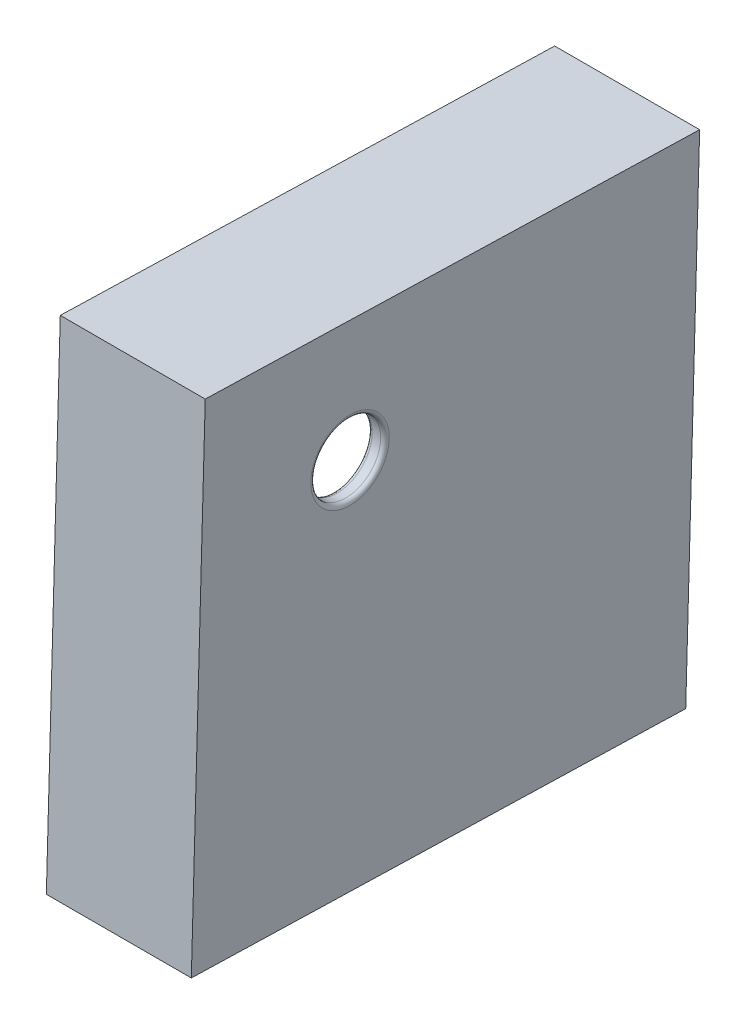
ISO-10303-21;
HEADER;
FILE_DESCRIPTION(('STEP AP214'),'2;1');
FILE_NAME('part.step','',(''),(''),'','','');
FILE_SCHEMA(('AUTOMOTIVE_DESIGN { 1 0 10303 214 1 1 1 1 }'));
ENDSEC;
DATA;
#1=APPLICATION_CONTEXT('core data for automotive mechanical design processes');
#2=APPLICATION_PROTOCOL_DEFINITION('international standard','automotive_design',2000,#1);
#3=PRODUCT_CONTEXT('',#1,'mechanical');
#4=PRODUCT('Part','Part','',(#3));
#5=PRODUCT_RELATED_PRODUCT_CATEGORY('part','',(#4));
#6=PRODUCT_DEFINITION_FORMATION('','',#4);
#7=PRODUCT_DEFINITION_CONTEXT('part definition',#1,'design');
#8=PRODUCT_DEFINITION('design','',#6,#7);
#9=PRODUCT_DEFINITION_SHAPE('','',#8);
#10=(LENGTH_UNIT() NAMED_UNIT(*) SI_UNIT(.MILLI.,.METRE.));
#11=(NAMED_UNIT(*) PLANE_ANGLE_UNIT() SI_UNIT($,.RADIAN.));
#12=(NAMED_UNIT(*) SI_UNIT($,.STERADIAN.) SOLID_ANGLE_UNIT());
#13=UNCERTAINTY_MEASURE_WITH_UNIT(LENGTH_MEASURE(1.E-05),#10,'distance_accuracy_value','');
#14=(GEOMETRIC_REPRESENTATION_CONTEXT(3) GLOBAL_UNCERTAINTY_ASSIGNED_CONTEXT((#13)) GLOBAL_UNIT_ASSIGNED_CONTEXT((#10,
#11,#12)) REPRESENTATION_CONTEXT('',''));
#15=CARTESIAN_POINT('',(0.,0.,0.));
#16=DIRECTION('',(0.,0.,1.));
#17=DIRECTION('',(1.,0.,0.));
#18=AXIS2_PLACEMENT_3D('',#15,#16,#17);
#19=CARTESIAN_POINT('',(-15.,0.,0.));
#20=DIRECTION('',(1.,0.,0.));
#21=DIRECTION('',(0.,0.,-1.));
#22=AXIS2_PLACEMENT_3D('',#19,#20,#21);
#23=PLANE('',#22);
#24=DIRECTION('',(0.,0.0281634546287368,0.999603331238634));
#25=VECTOR('',#24,1.);
#26=CARTESIAN_POINT('',(-15.,5.50132580674706,5.1891220228491));
#27=LINE('',#26,#25);
#28=CARTESIAN_POINT('',(-15.,3.98049925679527,-48.7894578640372));
#29=VERTEX_POINT('',#28);
#30=CARTESIAN_POINT('',(-15.,5.50132580674706,5.1891220228491));
#31=VERTEX_POINT('',#30);
#32=EDGE_CURVE('E175',#29,#31,#27,.T.);
#33=ORIENTED_EDGE('',*,*,#32,.T.);
#34=DIRECTION('',(0.,-0.999603331238634,0.0281634546287368));
#35=VECTOR('',#34,1.);
#36=CARTESIAN_POINT('',(-15.,-48.4772540801392,6.70994857280088));
#37=LINE('',#36,#35);
#38=CARTESIAN_POINT('',(-15.,-48.4772540801392,6.70994857280088));
#39=VERTEX_POINT('',#38);
#40=EDGE_CURVE('E11',#31,#39,#37,.T.);
#41=ORIENTED_EDGE('',*,*,#40,.T.);
#42=DIRECTION('',(0.,-0.028163454628737,-0.999603331238634));
#43=VECTOR('',#42,1.);
#44=CARTESIAN_POINT('',(-15.,-49.998080630091,-47.2686313140854));
#45=LINE('',#44,#43);
#46=CARTESIAN_POINT('',(-15.,-49.998080630091,-47.2686313140854));
#47=VERTEX_POINT('',#46);
#48=EDGE_CURVE('E51',#39,#47,#45,.T.);
#49=ORIENTED_EDGE('',*,*,#48,.T.);
#50=DIRECTION('',(0.,0.999603331238634,-0.0281634546287368));
#51=VECTOR('',#50,1.);
#52=CARTESIAN_POINT('',(-15.,3.98049925679527,-48.7894578640372));
#53=LINE('',#52,#51);
#54=EDGE_CURVE('E173',#47,#29,#53,.T.);
#55=ORIENTED_EDGE('',*,*,#54,.T.);
#56=EDGE_LOOP('',(#33,#41,#49,#55));
#57=FACE_BOUND('',#56,.T.);
#58=DIRECTION('',(0.,-0.999603331238634,0.0281634546287368));
#59=VECTOR('',#58,1.);
#60=CARTESIAN_POINT('',(-15.,-50.420133833359,8.76548214453563));
#61=LINE('',#60,#59);
#62=CARTESIAN_POINT('',(-15.,7.5568593784818,7.13200177606889));
#63=VERTEX_POINT('',#62);
#64=CARTESIAN_POINT('',(-15.,-50.420133833359,8.76548214453563));
#65=VERTEX_POINT('',#64);
#66=EDGE_CURVE('E179',#63,#65,#61,.T.);
#67=ORIENTED_EDGE('',*,*,#66,.F.);
#68=DIRECTION('',(0.,0.0281634546287368,0.999603331238634));
#69=VECTOR('',#68,1.);
#70=CARTESIAN_POINT('',(-15.,7.5568593784818,7.13200177606889));
#71=LINE('',#70,#69);
#72=CARTESIAN_POINT('',(-15.,5.92337901001507,-50.8449914357719));
#73=VERTEX_POINT('',#72);
#74=EDGE_CURVE('E178',#73,#63,#71,.T.);
#75=ORIENTED_EDGE('',*,*,#74,.F.);
#76=DIRECTION('',(0.,0.999603331238634,-0.0281634546287367));
#77=VECTOR('',#76,1.);
#78=CARTESIAN_POINT('',(-15.,5.92337901001507,-50.8449914357719));
#79=LINE('',#78,#77);
#80=CARTESIAN_POINT('',(-15.,-52.0536142018258,-49.2115110673052));
#81=VERTEX_POINT('',#80);
#82=EDGE_CURVE('E170',#81,#73,#79,.T.);
#83=ORIENTED_EDGE('',*,*,#82,.F.);
#84=DIRECTION('',(0.,-0.0281634546287368,-0.999603331238634));
#85=VECTOR('',#84,1.);
#86=CARTESIAN_POINT('',(-15.,-52.0536142018258,-49.2115110673052));
#87=LINE('',#86,#85);
#88=EDGE_CURVE('E46',#65,#81,#87,.T.);
#89=ORIENTED_EDGE('',*,*,#88,.F.);
#90=EDGE_LOOP('',(#67,#75,#83,#89));
#91=FACE_BOUND('',#90,.T.);
#92=ADVANCED_FACE('F43',(#57,#91),#23,.F.);
#93=CARTESIAN_POINT('',(-18.61,-52.0536142018258,-49.2115110673052));
#94=DIRECTION('',(0.,0.999603331238634,-0.0281634546287368));
#95=DIRECTION('',(0.,0.0281634546287368,0.999603331238634));
#96=AXIS2_PLACEMENT_3D('',#93,#94,#95);
#97=PLANE('',#96);
#98=DIRECTION('',(1.,0.,0.));
#99=VECTOR('',#98,1.);
#100=CARTESIAN_POINT('',(-18.61,-50.420133833359,8.76548214453563));
#101=LINE('',#100,#99);
#102=CARTESIAN_POINT('',(2.,-50.420133833359,8.76548214453563));
#103=VERTEX_POINT('',#102);
#104=EDGE_CURVE('E157',#65,#103,#101,.T.);
#105=ORIENTED_EDGE('',*,*,#104,.F.);
#106=ORIENTED_EDGE('',*,*,#88,.T.);
#107=DIRECTION('',(1.,0.,0.));
#108=VECTOR('',#107,1.);
#109=CARTESIAN_POINT('',(-18.61,-52.0536142018258,-49.2115110673052));
#110=LINE('',#109,#108);
#111=CARTESIAN_POINT('',(2.,-52.0536142018258,-49.2115110673052));
#112=VERTEX_POINT('',#111);
#113=EDGE_CURVE('E107',#81,#112,#110,.T.);
#114=ORIENTED_EDGE('',*,*,#113,.T.);
#115=DIRECTION('',(0.,-0.0281634546287368,-0.999603331238634));
#116=VECTOR('',#115,1.);
#117=CARTESIAN_POINT('',(2.,-52.0536142018258,-49.2115110673052));
#118=LINE('',#117,#116);
#119=EDGE_CURVE('E112',#103,#112,#118,.T.);
#120=ORIENTED_EDGE('',*,*,#119,.F.);
#121=EDGE_LOOP('',(#105,#106,#114,#120));
#122=FACE_BOUND('',#121,.T.);
#123=ADVANCED_FACE('F110',(#122),#97,.F.);
#124=CARTESIAN_POINT('',(-18.61,-50.420133833359,8.76548214453563));
#125=DIRECTION('',(0.,-0.0281634546287368,-0.999603331238634));
#126=DIRECTION('',(0.,0.999603331238634,-0.0281634546287368));
#127=AXIS2_PLACEMENT_3D('',#124,#125,#126);
#128=PLANE('',#127);
#129=DIRECTION('',(1.,0.,0.));
#130=VECTOR('',#129,1.);
#131=CARTESIAN_POINT('',(-18.61,7.5568593784818,7.13200177606889));
#132=LINE('',#131,#130);
#133=CARTESIAN_POINT('',(2.,7.5568593784818,7.13200177606889));
#134=VERTEX_POINT('',#133);
#135=EDGE_CURVE('E155',#63,#134,#132,.T.);
#136=ORIENTED_EDGE('',*,*,#135,.F.);
#137=ORIENTED_EDGE('',*,*,#66,.T.);
#138=ORIENTED_EDGE('',*,*,#104,.T.);
#139=DIRECTION('',(0.,-0.999603331238634,0.0281634546287368));
#140=VECTOR('',#139,1.);
#141=CARTESIAN_POINT('',(2.,-50.420133833359,8.76548214453563));
#142=LINE('',#141,#140);
#143=EDGE_CURVE('E130',#134,#103,#142,.T.);
#144=ORIENTED_EDGE('',*,*,#143,.F.);
#145=EDGE_LOOP('',(#136,#137,#138,#144));
#146=FACE_BOUND('',#145,.T.);
#147=ADVANCED_FACE('F184',(#146),#128,.F.);
#148=CARTESIAN_POINT('',(-18.61,7.5568593784818,7.13200177606889));
#149=DIRECTION('',(0.,-0.999603331238634,0.0281634546287368));
#150=DIRECTION('',(0.,-0.0281634546287368,-0.999603331238634));
#151=AXIS2_PLACEMENT_3D('',#148,#149,#150);
#152=PLANE('',#151);
#153=DIRECTION('',(1.,0.,0.));
#154=VECTOR('',#153,1.);
#155=CARTESIAN_POINT('',(-18.61,5.92337901001507,-50.8449914357719));
#156=LINE('',#155,#154);
#157=CARTESIAN_POINT('',(2.,5.92337901001507,-50.8449914357719));
#158=VERTEX_POINT('',#157);
#159=EDGE_CURVE('E115',#73,#158,#156,.T.);
#160=ORIENTED_EDGE('',*,*,#159,.F.);
#161=ORIENTED_EDGE('',*,*,#74,.T.);
#162=ORIENTED_EDGE('',*,*,#135,.T.);
#163=DIRECTION('',(0.,0.0281634546287368,0.999603331238634));
#164=VECTOR('',#163,1.);
#165=CARTESIAN_POINT('',(2.,7.5568593784818,7.13200177606889));
#166=LINE('',#165,#164);
#167=EDGE_CURVE('E125',#158,#134,#166,.T.);
#168=ORIENTED_EDGE('',*,*,#167,.F.);
#169=EDGE_LOOP('',(#160,#161,#162,#168));
#170=FACE_BOUND('',#169,.T.);
#171=ADVANCED_FACE('F188',(#170),#152,.F.);
#172=CARTESIAN_POINT('',(-18.61,5.92337901001507,-50.8449914357719));
#173=DIRECTION('',(0.,0.0281634546287367,0.999603331238634));
#174=DIRECTION('',(0.,-0.999603331238634,0.0281634546287367));
#175=AXIS2_PLACEMENT_3D('',#172,#173,#174);
#176=PLANE('',#175);
#177=ORIENTED_EDGE('',*,*,#113,.F.);
#178=ORIENTED_EDGE('',*,*,#82,.T.);
#179=ORIENTED_EDGE('',*,*,#159,.T.);
#180=DIRECTION('',(0.,0.999603331238634,-0.0281634546287367));
#181=VECTOR('',#180,1.);
#182=CARTESIAN_POINT('',(2.,5.92337901001507,-50.8449914357719));
#183=LINE('',#182,#181);
#184=EDGE_CURVE('E119',#112,#158,#183,.T.);
#185=ORIENTED_EDGE('',*,*,#184,.F.);
#186=EDGE_LOOP('',(#177,#178,#179,#185));
#187=FACE_BOUND('',#186,.T.);
#188=ADVANCED_FACE('F120',(#187),#176,.F.);
#189=CARTESIAN_POINT('',(-18.61,5.50132580674706,5.1891220228491));
#190=DIRECTION('',(0.,-0.999603331238634,0.0281634546287368));
#191=DIRECTION('',(0.,-0.0281634546287368,-0.999603331238634));
#192=AXIS2_PLACEMENT_3D('',#189,#190,#191);
#193=PLANE('',#192);
#194=ORIENTED_EDGE('',*,*,#32,.F.);
#195=DIRECTION('',(1.,0.,0.));
#196=VECTOR('',#195,1.);
#197=CARTESIAN_POINT('',(-18.61,3.98049925679527,-48.7894578640372));
#198=LINE('',#197,#196);
#199=CARTESIAN_POINT('',(0.,3.98049925679527,-48.7894578640372));
#200=VERTEX_POINT('',#199);
#201=EDGE_CURVE('E116',#29,#200,#198,.T.);
#202=ORIENTED_EDGE('',*,*,#201,.T.);
#203=DIRECTION('',(0.,-0.0281634546287368,-0.999603331238634));
#204=VECTOR('',#203,1.);
#205=CARTESIAN_POINT('',(0.,5.50132580674706,5.1891220228491));
#206=LINE('',#205,#204);
#207=CARTESIAN_POINT('',(0.,5.50132580674706,5.1891220228491));
#208=VERTEX_POINT('',#207);
#209=EDGE_CURVE('E135',#208,#200,#206,.T.);
#210=ORIENTED_EDGE('',*,*,#209,.F.);
#211=DIRECTION('',(1.,0.,0.));
#212=VECTOR('',#211,1.);
#213=CARTESIAN_POINT('',(-18.61,5.50132580674706,5.1891220228491));
#214=LINE('',#213,#212);
#215=EDGE_CURVE('E147',#31,#208,#214,.T.);
#216=ORIENTED_EDGE('',*,*,#215,.F.);
#217=EDGE_LOOP('',(#194,#202,#210,#216));
#218=FACE_BOUND('',#217,.T.);
#219=ADVANCED_FACE('F195',(#218),#193,.T.);
#220=CARTESIAN_POINT('',(-18.61,3.98049925679527,-48.7894578640372));
#221=DIRECTION('',(0.,0.0281634546287368,0.999603331238634));
#222=DIRECTION('',(0.,-0.999603331238634,0.0281634546287368));
#223=AXIS2_PLACEMENT_3D('',#220,#221,#222);
#224=PLANE('',#223);
#225=ORIENTED_EDGE('',*,*,#54,.F.);
#226=DIRECTION('',(1.,0.,0.));
#227=VECTOR('',#226,1.);
#228=CARTESIAN_POINT('',(-18.61,-49.998080630091,-47.2686313140854));
#229=LINE('',#228,#227);
#230=CARTESIAN_POINT('',(0.,-49.998080630091,-47.2686313140854));
#231=VERTEX_POINT('',#230);
#232=EDGE_CURVE('E151',#47,#231,#229,.T.);
#233=ORIENTED_EDGE('',*,*,#232,.T.);
#234=DIRECTION('',(0.,-0.999603331238634,0.0281634546287368));
#235=VECTOR('',#234,1.);
#236=CARTESIAN_POINT('',(0.,3.98049925679527,-48.7894578640372));
#237=LINE('',#236,#235);
#238=EDGE_CURVE('E138',#200,#231,#237,.T.);
#239=ORIENTED_EDGE('',*,*,#238,.F.);
#240=ORIENTED_EDGE('',*,*,#201,.F.);
#241=EDGE_LOOP('',(#225,#233,#239,#240));
#242=FACE_BOUND('',#241,.T.);
#243=ADVANCED_FACE('F234',(#242),#224,.T.);
#244=CARTESIAN_POINT('',(-18.61,-49.998080630091,-47.2686313140854));
#245=DIRECTION('',(0.,0.999603331238634,-0.028163454628737));
#246=DIRECTION('',(0.,0.028163454628737,0.999603331238634));
#247=AXIS2_PLACEMENT_3D('',#244,#245,#246);
#248=PLANE('',#247);
#249=ORIENTED_EDGE('',*,*,#48,.F.);
#250=DIRECTION('',(1.,0.,0.));
#251=VECTOR('',#250,1.);
#252=CARTESIAN_POINT('',(-18.61,-48.4772540801392,6.70994857280088));
#253=LINE('',#252,#251);
#254=CARTESIAN_POINT('',(0.,-48.4772540801392,6.70994857280088));
#255=VERTEX_POINT('',#254);
#256=EDGE_CURVE('E149',#39,#255,#253,.T.);
#257=ORIENTED_EDGE('',*,*,#256,.T.);
#258=DIRECTION('',(0.,0.028163454628737,0.999603331238634));
#259=VECTOR('',#258,1.);
#260=CARTESIAN_POINT('',(0.,-49.998080630091,-47.2686313140854));
#261=LINE('',#260,#259);
#262=EDGE_CURVE('E141',#231,#255,#261,.T.);
#263=ORIENTED_EDGE('',*,*,#262,.F.);
#264=ORIENTED_EDGE('',*,*,#232,.F.);
#265=EDGE_LOOP('',(#249,#257,#263,#264));
#266=FACE_BOUND('',#265,.T.);
#267=ADVANCED_FACE('F235',(#266),#248,.T.);
#268=CARTESIAN_POINT('',(-18.61,-48.4772540801392,6.70994857280088));
#269=DIRECTION('',(0.,-0.0281634546287368,-0.999603331238634));
#270=DIRECTION('',(0.,0.999603331238634,-0.0281634546287368));
#271=AXIS2_PLACEMENT_3D('',#268,#269,#270);
#272=PLANE('',#271);
#273=ORIENTED_EDGE('',*,*,#40,.F.);
#274=ORIENTED_EDGE('',*,*,#215,.T.);
#275=DIRECTION('',(0.,0.999603331238634,-0.0281634546287368));
#276=VECTOR('',#275,1.);
#277=CARTESIAN_POINT('',(0.,-48.4772540801392,6.70994857280088));
#278=LINE('',#277,#276);
#279=EDGE_CURVE('E144',#255,#208,#278,.T.);
#280=ORIENTED_EDGE('',*,*,#279,.F.);
#281=ORIENTED_EDGE('',*,*,#256,.F.);
#282=EDGE_LOOP('',(#273,#274,#280,#281));
#283=FACE_BOUND('',#282,.T.);
#284=ADVANCED_FACE('F227',(#283),#272,.T.);
#285=CARTESIAN_POINT('',(2.,0.,0.));
#286=DIRECTION('',(-1.,0.,0.));
#287=DIRECTION('',(0.,0.,1.));
#288=AXIS2_PLACEMENT_3D('',#285,#286,#287);
#289=PLANE('',#288);
#290=CARTESIAN_POINT('',(2.,-7.13279623081204,-9.84503414650285));
#291=DIRECTION('',(-1.,0.,0.));
#292=DIRECTION('',(0.,0.,1.));
#293=AXIS2_PLACEMENT_3D('',#290,#291,#292);
#294=CIRCLE('',#293,4.6);
#295=CARTESIAN_POINT('',(2.,-7.13279623081204,-5.24503414650285));
#296=VERTEX_POINT('',#295);
#297=EDGE_CURVE('E165',#296,#296,#294,.T.);
#298=ORIENTED_EDGE('',*,*,#297,.T.);
#299=EDGE_LOOP('',(#298));
#300=FACE_BOUND('',#299,.T.);
#301=ORIENTED_EDGE('',*,*,#119,.T.);
#302=ORIENTED_EDGE('',*,*,#184,.T.);
#303=ORIENTED_EDGE('',*,*,#167,.T.);
#304=ORIENTED_EDGE('',*,*,#143,.T.);
#305=EDGE_LOOP('',(#301,#302,#303,#304));
#306=FACE_BOUND('',#305,.T.);
#307=ADVANCED_FACE('F128',(#300,#306),#289,.F.);
#308=CARTESIAN_POINT('',(0.,0.,0.));
#309=DIRECTION('',(-1.,0.,0.));
#310=DIRECTION('',(0.,0.,1.));
#311=AXIS2_PLACEMENT_3D('',#308,#309,#310);
#312=PLANE('',#311);
#313=CARTESIAN_POINT('',(0.,-7.13279623081204,-9.84503414650285));
#314=DIRECTION('',(-1.,0.,0.));
#315=DIRECTION('',(0.,0.,1.));
#316=AXIS2_PLACEMENT_3D('',#313,#314,#315);
#317=CIRCLE('',#316,4.6);
#318=CARTESIAN_POINT('',(0.,-7.13279623081204,-5.24503414650285));
#319=VERTEX_POINT('',#318);
#320=EDGE_CURVE('E168',#319,#319,#317,.F.);
#321=ORIENTED_EDGE('',*,*,#320,.T.);
#322=EDGE_LOOP('',(#321));
#323=FACE_BOUND('',#322,.T.);
#324=ORIENTED_EDGE('',*,*,#279,.T.);
#325=ORIENTED_EDGE('',*,*,#209,.T.);
#326=ORIENTED_EDGE('',*,*,#238,.T.);
#327=ORIENTED_EDGE('',*,*,#262,.T.);
#328=EDGE_LOOP('',(#324,#325,#326,#327));
#329=FACE_BOUND('',#328,.T.);
#330=ADVANCED_FACE('F220',(#323,#329),#312,.T.);
#331=CARTESIAN_POINT('',(2.,-7.13279623081204,-9.84503414650285));
#332=DIRECTION('',(-1.,0.,0.));
#333=DIRECTION('',(0.,0.,1.));
#334=AXIS2_PLACEMENT_3D('',#331,#332,#333);
#335=CYLINDRICAL_SURFACE('',#334,4.1);
#336=CARTESIAN_POINT('',(1.5,-7.13279623081204,-9.84503414650285));
#337=DIRECTION('',(-1.,0.,0.));
#338=DIRECTION('',(0.,0.,1.));
#339=AXIS2_PLACEMENT_3D('',#336,#337,#338);
#340=CIRCLE('',#339,4.1);
#341=CARTESIAN_POINT('',(1.5,-7.13279623081204,-5.74503414650285));
#342=VERTEX_POINT('',#341);
#343=EDGE_CURVE('E162',#342,#342,#340,.F.);
#344=ORIENTED_EDGE('',*,*,#343,.T.);
#345=EDGE_LOOP('',(#344));
#346=FACE_BOUND('',#345,.T.);
#347=CARTESIAN_POINT('',(0.5,-7.13279623081204,-9.84503414650285));
#348=DIRECTION('',(-1.,0.,0.));
#349=DIRECTION('',(0.,0.,1.));
#350=AXIS2_PLACEMENT_3D('',#347,#348,#349);
#351=CIRCLE('',#350,4.1);
#352=CARTESIAN_POINT('',(0.5,-7.13279623081204,-5.74503414650285));
#353=VERTEX_POINT('',#352);
#354=EDGE_CURVE('E159',#353,#353,#351,.T.);
#355=ORIENTED_EDGE('',*,*,#354,.T.);
#356=EDGE_LOOP('',(#355));
#357=FACE_BOUND('',#356,.T.);
#358=ADVANCED_FACE('F213',(#346,#357),#335,.F.);
#359=CARTESIAN_POINT('',(1.5,-7.13279623081204,-9.84503414650285));
#360=DIRECTION('',(-1.,0.,0.));
#361=DIRECTION('',(0.,0.,1.));
#362=AXIS2_PLACEMENT_3D('',#359,#360,#361);
#363=TOROIDAL_SURFACE('',#362,4.6,0.5);
#364=ORIENTED_EDGE('',*,*,#297,.F.);
#365=EDGE_LOOP('',(#364));
#366=FACE_BOUND('',#365,.T.);
#367=ORIENTED_EDGE('',*,*,#343,.F.);
#368=EDGE_LOOP('',(#367));
#369=FACE_BOUND('',#368,.T.);
#370=ADVANCED_FACE('F207',(#366,#369),#363,.T.);
#371=CARTESIAN_POINT('',(0.5,-7.13279623081204,-9.84503414650285));
#372=DIRECTION('',(-1.,0.,0.));
#373=DIRECTION('',(0.,0.,1.));
#374=AXIS2_PLACEMENT_3D('',#371,#372,#373);
#375=TOROIDAL_SURFACE('',#374,4.6,0.5);
#376=ORIENTED_EDGE('',*,*,#354,.F.);
#377=EDGE_LOOP('',(#376));
#378=FACE_BOUND('',#377,.T.);
#379=ORIENTED_EDGE('',*,*,#320,.F.);
#380=EDGE_LOOP('',(#379));
#381=FACE_BOUND('',#380,.T.);
#382=ADVANCED_FACE('F200',(#378,#381),#375,.T.);
#383=CLOSED_SHELL('',(#92,#123,#147,#171,#188,#219,#243,#267,#284,#307,#330,#358,#370,#382));
#384=MANIFOLD_SOLID_BREP('B2',#383);
#385=ADVANCED_BREP_SHAPE_REPRESENTATION('',(#18,#384),#14);
#386=SHAPE_DEFINITION_REPRESENTATION(#9,#385);
ENDSEC;
END-ISO-10303-21;
